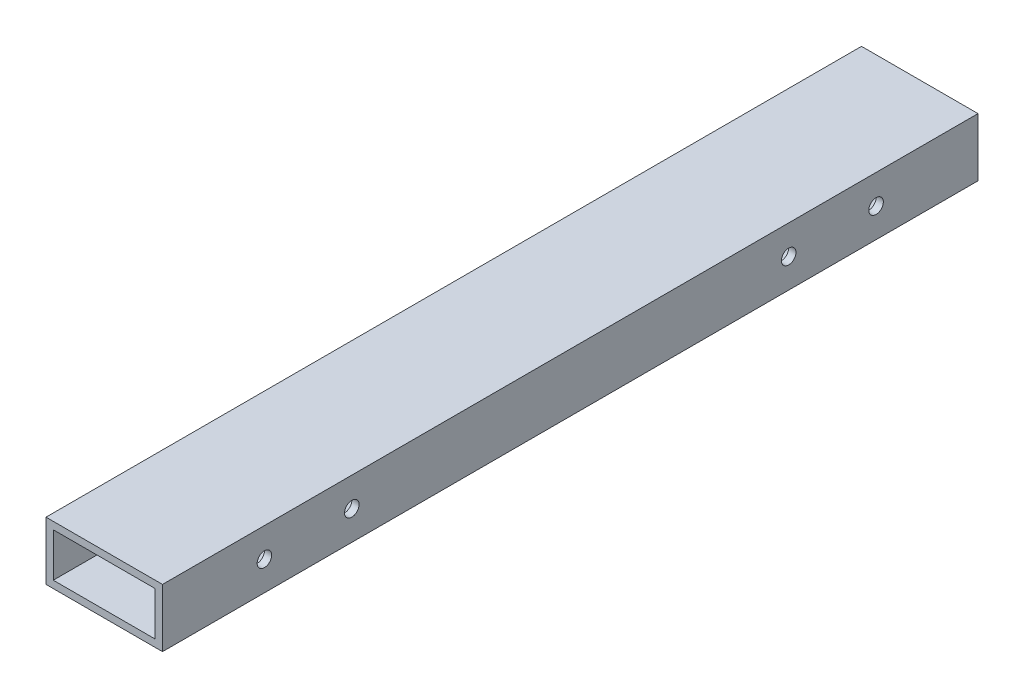
ISO-10303-21;
HEADER;
FILE_DESCRIPTION(('STEP AP214'),'2;1');
FILE_NAME('part.step','',(''),(''),'','','');
FILE_SCHEMA(('AUTOMOTIVE_DESIGN { 1 0 10303 214 1 1 1 1 }'));
ENDSEC;
DATA;
#1=APPLICATION_CONTEXT('core data for automotive mechanical design processes');
#2=APPLICATION_PROTOCOL_DEFINITION('international standard','automotive_design',2000,#1);
#3=PRODUCT_CONTEXT('',#1,'mechanical');
#4=PRODUCT('Part','Part','',(#3));
#5=PRODUCT_RELATED_PRODUCT_CATEGORY('part','',(#4));
#6=PRODUCT_DEFINITION_FORMATION('','',#4);
#7=PRODUCT_DEFINITION_CONTEXT('part definition',#1,'design');
#8=PRODUCT_DEFINITION('design','',#6,#7);
#9=PRODUCT_DEFINITION_SHAPE('','',#8);
#10=(LENGTH_UNIT() NAMED_UNIT(*) SI_UNIT(.MILLI.,.METRE.));
#11=(NAMED_UNIT(*) PLANE_ANGLE_UNIT() SI_UNIT($,.RADIAN.));
#12=(NAMED_UNIT(*) SI_UNIT($,.STERADIAN.) SOLID_ANGLE_UNIT());
#13=UNCERTAINTY_MEASURE_WITH_UNIT(LENGTH_MEASURE(1.E-05),#10,'distance_accuracy_value','');
#14=(GEOMETRIC_REPRESENTATION_CONTEXT(3) GLOBAL_UNCERTAINTY_ASSIGNED_CONTEXT((#13)) GLOBAL_UNIT_ASSIGNED_CONTEXT((#10,
#11,#12)) REPRESENTATION_CONTEXT('',''));
#15=CARTESIAN_POINT('',(0.,0.,0.));
#16=DIRECTION('',(0.,0.,1.));
#17=DIRECTION('',(1.,0.,0.));
#18=AXIS2_PLACEMENT_3D('',#15,#16,#17);
#19=CARTESIAN_POINT('',(0.,0.,355.6));
#20=DIRECTION('',(0.,0.,-1.));
#21=DIRECTION('',(-1.,0.,0.));
#22=AXIS2_PLACEMENT_3D('',#19,#20,#21);
#23=PLANE('',#22);
#24=DIRECTION('',(0.,-1.,0.));
#25=VECTOR('',#24,1.);
#26=CARTESIAN_POINT('',(0.,0.,355.6));
#27=LINE('',#26,#25);
#28=CARTESIAN_POINT('',(0.,25.4,355.6));
#29=VERTEX_POINT('',#28);
#30=CARTESIAN_POINT('',(0.,0.,355.6));
#31=VERTEX_POINT('',#30);
#32=EDGE_CURVE('E163',#29,#31,#27,.T.);
#33=ORIENTED_EDGE('',*,*,#32,.T.);
#34=DIRECTION('',(1.,0.,0.));
#35=VECTOR('',#34,1.);
#36=CARTESIAN_POINT('',(0.,0.,355.6));
#37=LINE('',#36,#35);
#38=CARTESIAN_POINT('',(50.8,0.,355.6));
#39=VERTEX_POINT('',#38);
#40=EDGE_CURVE('E167',#31,#39,#37,.T.);
#41=ORIENTED_EDGE('',*,*,#40,.T.);
#42=DIRECTION('',(0.,1.,0.));
#43=VECTOR('',#42,1.);
#44=CARTESIAN_POINT('',(50.8,0.,355.6));
#45=LINE('',#44,#43);
#46=CARTESIAN_POINT('',(50.8,25.4,355.6));
#47=VERTEX_POINT('',#46);
#48=EDGE_CURVE('E171',#39,#47,#45,.T.);
#49=ORIENTED_EDGE('',*,*,#48,.T.);
#50=DIRECTION('',(-1.,0.,0.));
#51=VECTOR('',#50,1.);
#52=CARTESIAN_POINT('',(0.,25.4,355.6));
#53=LINE('',#52,#51);
#54=EDGE_CURVE('E174',#47,#29,#53,.T.);
#55=ORIENTED_EDGE('',*,*,#54,.T.);
#56=EDGE_LOOP('',(#33,#41,#49,#55));
#57=FACE_BOUND('',#56,.T.);
#58=DIRECTION('',(0.,-1.,0.));
#59=VECTOR('',#58,1.);
#60=CARTESIAN_POINT('',(3.175,3.175,355.6));
#61=LINE('',#60,#59);
#62=CARTESIAN_POINT('',(3.175,22.225,355.6));
#63=VERTEX_POINT('',#62);
#64=CARTESIAN_POINT('',(3.175,3.175,355.6));
#65=VERTEX_POINT('',#64);
#66=EDGE_CURVE('E113',#63,#65,#61,.T.);
#67=ORIENTED_EDGE('',*,*,#66,.F.);
#68=DIRECTION('',(-1.,0.,0.));
#69=VECTOR('',#68,1.);
#70=CARTESIAN_POINT('',(3.175,22.225,355.6));
#71=LINE('',#70,#69);
#72=CARTESIAN_POINT('',(47.625,22.225,355.6));
#73=VERTEX_POINT('',#72);
#74=EDGE_CURVE('E139',#73,#63,#71,.T.);
#75=ORIENTED_EDGE('',*,*,#74,.F.);
#76=DIRECTION('',(0.,1.,0.));
#77=VECTOR('',#76,1.);
#78=CARTESIAN_POINT('',(47.625,3.175,355.6));
#79=LINE('',#78,#77);
#80=CARTESIAN_POINT('',(47.625,3.175,355.6));
#81=VERTEX_POINT('',#80);
#82=EDGE_CURVE('E135',#81,#73,#79,.T.);
#83=ORIENTED_EDGE('',*,*,#82,.F.);
#84=DIRECTION('',(1.,0.,0.));
#85=VECTOR('',#84,1.);
#86=CARTESIAN_POINT('',(3.175,3.175,355.6));
#87=LINE('',#86,#85);
#88=EDGE_CURVE('E122',#65,#81,#87,.T.);
#89=ORIENTED_EDGE('',*,*,#88,.F.);
#90=EDGE_LOOP('',(#67,#75,#83,#89));
#91=FACE_BOUND('',#90,.T.);
#92=ADVANCED_FACE('F45',(#57,#91),#23,.F.);
#93=CARTESIAN_POINT('',(0.,0.,0.));
#94=DIRECTION('',(0.,0.,-1.));
#95=DIRECTION('',(-1.,0.,0.));
#96=AXIS2_PLACEMENT_3D('',#93,#94,#95);
#97=PLANE('',#96);
#98=DIRECTION('',(0.,-1.,0.));
#99=VECTOR('',#98,1.);
#100=CARTESIAN_POINT('',(0.,0.,0.));
#101=LINE('',#100,#99);
#102=CARTESIAN_POINT('',(0.,25.4,0.));
#103=VERTEX_POINT('',#102);
#104=CARTESIAN_POINT('',(0.,0.,0.));
#105=VERTEX_POINT('',#104);
#106=EDGE_CURVE('E131',#103,#105,#101,.T.);
#107=ORIENTED_EDGE('',*,*,#106,.F.);
#108=DIRECTION('',(-1.,0.,0.));
#109=VECTOR('',#108,1.);
#110=CARTESIAN_POINT('',(0.,25.4,0.));
#111=LINE('',#110,#109);
#112=CARTESIAN_POINT('',(50.8,25.4,0.));
#113=VERTEX_POINT('',#112);
#114=EDGE_CURVE('E168',#113,#103,#111,.T.);
#115=ORIENTED_EDGE('',*,*,#114,.F.);
#116=DIRECTION('',(0.,1.,0.));
#117=VECTOR('',#116,1.);
#118=CARTESIAN_POINT('',(50.8,0.,0.));
#119=LINE('',#118,#117);
#120=CARTESIAN_POINT('',(50.8,0.,0.));
#121=VERTEX_POINT('',#120);
#122=EDGE_CURVE('E184',#121,#113,#119,.T.);
#123=ORIENTED_EDGE('',*,*,#122,.F.);
#124=DIRECTION('',(1.,0.,0.));
#125=VECTOR('',#124,1.);
#126=CARTESIAN_POINT('',(0.,0.,0.));
#127=LINE('',#126,#125);
#128=EDGE_CURVE('E181',#105,#121,#127,.T.);
#129=ORIENTED_EDGE('',*,*,#128,.F.);
#130=EDGE_LOOP('',(#107,#115,#123,#129));
#131=FACE_BOUND('',#130,.T.);
#132=DIRECTION('',(-1.,0.,0.));
#133=VECTOR('',#132,1.);
#134=CARTESIAN_POINT('',(3.175,22.225,0.));
#135=LINE('',#134,#133);
#136=CARTESIAN_POINT('',(47.625,22.225,0.));
#137=VERTEX_POINT('',#136);
#138=CARTESIAN_POINT('',(3.175,22.225,0.));
#139=VERTEX_POINT('',#138);
#140=EDGE_CURVE('E123',#137,#139,#135,.T.);
#141=ORIENTED_EDGE('',*,*,#140,.T.);
#142=DIRECTION('',(0.,-1.,0.));
#143=VECTOR('',#142,1.);
#144=CARTESIAN_POINT('',(3.175,3.175,0.));
#145=LINE('',#144,#143);
#146=CARTESIAN_POINT('',(3.175,3.175,0.));
#147=VERTEX_POINT('',#146);
#148=EDGE_CURVE('E71',#139,#147,#145,.T.);
#149=ORIENTED_EDGE('',*,*,#148,.T.);
#150=DIRECTION('',(1.,0.,0.));
#151=VECTOR('',#150,1.);
#152=CARTESIAN_POINT('',(3.175,3.175,0.));
#153=LINE('',#152,#151);
#154=CARTESIAN_POINT('',(47.625,3.175,0.));
#155=VERTEX_POINT('',#154);
#156=EDGE_CURVE('E129',#147,#155,#153,.T.);
#157=ORIENTED_EDGE('',*,*,#156,.T.);
#158=DIRECTION('',(0.,1.,0.));
#159=VECTOR('',#158,1.);
#160=CARTESIAN_POINT('',(47.625,3.175,0.));
#161=LINE('',#160,#159);
#162=EDGE_CURVE('E150',#155,#137,#161,.T.);
#163=ORIENTED_EDGE('',*,*,#162,.T.);
#164=EDGE_LOOP('',(#141,#149,#157,#163));
#165=FACE_BOUND('',#164,.T.);
#166=ADVANCED_FACE('F248',(#131,#165),#97,.T.);
#167=CARTESIAN_POINT('',(0.,0.,355.6));
#168=DIRECTION('',(1.,0.,0.));
#169=DIRECTION('',(0.,0.,-1.));
#170=AXIS2_PLACEMENT_3D('',#167,#168,#169);
#171=PLANE('',#170);
#172=CARTESIAN_POINT('',(0.,12.7,311.15));
#173=DIRECTION('',(1.,0.,0.));
#174=DIRECTION('',(0.,0.,-1.));
#175=AXIS2_PLACEMENT_3D('',#172,#173,#174);
#176=CIRCLE('',#175,3.17499999999997);
#177=CARTESIAN_POINT('',(0.,12.7,307.975));
#178=VERTEX_POINT('',#177);
#179=EDGE_CURVE('E204',#178,#178,#176,.T.);
#180=ORIENTED_EDGE('',*,*,#179,.T.);
#181=EDGE_LOOP('',(#180));
#182=FACE_BOUND('',#181,.T.);
#183=CARTESIAN_POINT('',(0.,12.7,82.55));
#184=DIRECTION('',(1.,0.,0.));
#185=DIRECTION('',(0.,0.,1.));
#186=AXIS2_PLACEMENT_3D('',#183,#184,#185);
#187=CIRCLE('',#186,3.17499999999997);
#188=CARTESIAN_POINT('',(0.,12.7,85.7249999999999));
#189=VERTEX_POINT('',#188);
#190=EDGE_CURVE('E306',#189,#189,#187,.T.);
#191=ORIENTED_EDGE('',*,*,#190,.T.);
#192=EDGE_LOOP('',(#191));
#193=FACE_BOUND('',#192,.T.);
#194=CARTESIAN_POINT('',(0.,12.7,44.4499999999999));
#195=DIRECTION('',(1.,0.,0.));
#196=DIRECTION('',(0.,0.,1.));
#197=AXIS2_PLACEMENT_3D('',#194,#195,#196);
#198=CIRCLE('',#197,3.17499999999997);
#199=CARTESIAN_POINT('',(0.,12.7,47.6249999999999));
#200=VERTEX_POINT('',#199);
#201=EDGE_CURVE('E310',#200,#200,#198,.T.);
#202=ORIENTED_EDGE('',*,*,#201,.T.);
#203=EDGE_LOOP('',(#202));
#204=FACE_BOUND('',#203,.T.);
#205=CARTESIAN_POINT('',(0.,12.7,273.05));
#206=DIRECTION('',(1.,0.,0.));
#207=DIRECTION('',(0.,0.,-1.));
#208=AXIS2_PLACEMENT_3D('',#205,#206,#207);
#209=CIRCLE('',#208,3.17499999999997);
#210=CARTESIAN_POINT('',(0.,12.7,269.875));
#211=VERTEX_POINT('',#210);
#212=EDGE_CURVE('E313',#211,#211,#209,.T.);
#213=ORIENTED_EDGE('',*,*,#212,.T.);
#214=EDGE_LOOP('',(#213));
#215=FACE_BOUND('',#214,.T.);
#216=ORIENTED_EDGE('',*,*,#106,.T.);
#217=DIRECTION('',(0.,0.,-1.));
#218=VECTOR('',#217,1.);
#219=CARTESIAN_POINT('',(0.,0.,355.6));
#220=LINE('',#219,#218);
#221=EDGE_CURVE('E11',#31,#105,#220,.T.);
#222=ORIENTED_EDGE('',*,*,#221,.F.);
#223=ORIENTED_EDGE('',*,*,#32,.F.);
#224=DIRECTION('',(0.,0.,-1.));
#225=VECTOR('',#224,1.);
#226=CARTESIAN_POINT('',(0.,25.4,355.6));
#227=LINE('',#226,#225);
#228=EDGE_CURVE('E177',#29,#103,#227,.T.);
#229=ORIENTED_EDGE('',*,*,#228,.T.);
#230=EDGE_LOOP('',(#216,#222,#223,#229));
#231=FACE_BOUND('',#230,.T.);
#232=ADVANCED_FACE('F47',(#182,#193,#204,#215,#231),#171,.F.);
#233=CARTESIAN_POINT('',(0.,0.,355.6));
#234=DIRECTION('',(0.,1.,0.));
#235=DIRECTION('',(0.,0.,1.));
#236=AXIS2_PLACEMENT_3D('',#233,#234,#235);
#237=PLANE('',#236);
#238=ORIENTED_EDGE('',*,*,#128,.T.);
#239=DIRECTION('',(0.,0.,-1.));
#240=VECTOR('',#239,1.);
#241=CARTESIAN_POINT('',(50.8,0.,355.6));
#242=LINE('',#241,#240);
#243=EDGE_CURVE('E55',#39,#121,#242,.T.);
#244=ORIENTED_EDGE('',*,*,#243,.F.);
#245=ORIENTED_EDGE('',*,*,#40,.F.);
#246=ORIENTED_EDGE('',*,*,#221,.T.);
#247=EDGE_LOOP('',(#238,#244,#245,#246));
#248=FACE_BOUND('',#247,.T.);
#249=ADVANCED_FACE('F279',(#248),#237,.F.);
#250=CARTESIAN_POINT('',(50.8,0.,355.6));
#251=DIRECTION('',(-1.,0.,0.));
#252=DIRECTION('',(0.,0.,1.));
#253=AXIS2_PLACEMENT_3D('',#250,#251,#252);
#254=PLANE('',#253);
#255=CARTESIAN_POINT('',(50.8,12.7,311.15));
#256=DIRECTION('',(1.,0.,0.));
#257=DIRECTION('',(0.,0.,-1.));
#258=AXIS2_PLACEMENT_3D('',#255,#256,#257);
#259=CIRCLE('',#258,3.17499999999997);
#260=CARTESIAN_POINT('',(50.8,12.7,307.975));
#261=VERTEX_POINT('',#260);
#262=EDGE_CURVE('E322',#261,#261,#259,.T.);
#263=ORIENTED_EDGE('',*,*,#262,.F.);
#264=EDGE_LOOP('',(#263));
#265=FACE_BOUND('',#264,.T.);
#266=CARTESIAN_POINT('',(50.8,12.7,82.55));
#267=DIRECTION('',(1.,0.,0.));
#268=DIRECTION('',(0.,0.,1.));
#269=AXIS2_PLACEMENT_3D('',#266,#267,#268);
#270=CIRCLE('',#269,3.17499999999997);
#271=CARTESIAN_POINT('',(50.8,12.7,85.7249999999999));
#272=VERTEX_POINT('',#271);
#273=EDGE_CURVE('E328',#272,#272,#270,.T.);
#274=ORIENTED_EDGE('',*,*,#273,.F.);
#275=EDGE_LOOP('',(#274));
#276=FACE_BOUND('',#275,.T.);
#277=CARTESIAN_POINT('',(50.8,12.7,44.4499999999999));
#278=DIRECTION('',(1.,0.,0.));
#279=DIRECTION('',(0.,0.,1.));
#280=AXIS2_PLACEMENT_3D('',#277,#278,#279);
#281=CIRCLE('',#280,3.17499999999997);
#282=CARTESIAN_POINT('',(50.8,12.7,47.6249999999999));
#283=VERTEX_POINT('',#282);
#284=EDGE_CURVE('E317',#283,#283,#281,.T.);
#285=ORIENTED_EDGE('',*,*,#284,.F.);
#286=EDGE_LOOP('',(#285));
#287=FACE_BOUND('',#286,.T.);
#288=CARTESIAN_POINT('',(50.8,12.7,273.05));
#289=DIRECTION('',(1.,0.,0.));
#290=DIRECTION('',(0.,0.,-1.));
#291=AXIS2_PLACEMENT_3D('',#288,#289,#290);
#292=CIRCLE('',#291,3.17499999999997);
#293=CARTESIAN_POINT('',(50.8,12.7,269.875));
#294=VERTEX_POINT('',#293);
#295=EDGE_CURVE('E316',#294,#294,#292,.T.);
#296=ORIENTED_EDGE('',*,*,#295,.F.);
#297=EDGE_LOOP('',(#296));
#298=FACE_BOUND('',#297,.T.);
#299=ORIENTED_EDGE('',*,*,#122,.T.);
#300=DIRECTION('',(0.,0.,-1.));
#301=VECTOR('',#300,1.);
#302=CARTESIAN_POINT('',(50.8,25.4,355.6));
#303=LINE('',#302,#301);
#304=EDGE_CURVE('E192',#47,#113,#303,.T.);
#305=ORIENTED_EDGE('',*,*,#304,.F.);
#306=ORIENTED_EDGE('',*,*,#48,.F.);
#307=ORIENTED_EDGE('',*,*,#243,.T.);
#308=EDGE_LOOP('',(#299,#305,#306,#307));
#309=FACE_BOUND('',#308,.T.);
#310=ADVANCED_FACE('F276',(#265,#276,#287,#298,#309),#254,.F.);
#311=CARTESIAN_POINT('',(0.,25.4,355.6));
#312=DIRECTION('',(0.,-1.,0.));
#313=DIRECTION('',(0.,0.,-1.));
#314=AXIS2_PLACEMENT_3D('',#311,#312,#313);
#315=PLANE('',#314);
#316=ORIENTED_EDGE('',*,*,#114,.T.);
#317=ORIENTED_EDGE('',*,*,#228,.F.);
#318=ORIENTED_EDGE('',*,*,#54,.F.);
#319=ORIENTED_EDGE('',*,*,#304,.T.);
#320=EDGE_LOOP('',(#316,#317,#318,#319));
#321=FACE_BOUND('',#320,.T.);
#322=ADVANCED_FACE('F273',(#321),#315,.F.);
#323=CARTESIAN_POINT('',(3.175,3.175,355.6));
#324=DIRECTION('',(1.,0.,0.));
#325=DIRECTION('',(0.,0.,-1.));
#326=AXIS2_PLACEMENT_3D('',#323,#324,#325);
#327=PLANE('',#326);
#328=CARTESIAN_POINT('',(3.175,12.7,311.15));
#329=DIRECTION('',(1.,0.,0.));
#330=DIRECTION('',(0.,0.,-1.));
#331=AXIS2_PLACEMENT_3D('',#328,#329,#330);
#332=CIRCLE('',#331,3.17499999999997);
#333=CARTESIAN_POINT('',(3.175,12.7,307.975));
#334=VERTEX_POINT('',#333);
#335=EDGE_CURVE('E147',#334,#334,#332,.T.);
#336=ORIENTED_EDGE('',*,*,#335,.F.);
#337=EDGE_LOOP('',(#336));
#338=FACE_BOUND('',#337,.T.);
#339=CARTESIAN_POINT('',(3.175,12.7,82.55));
#340=DIRECTION('',(1.,0.,0.));
#341=DIRECTION('',(0.,0.,-1.));
#342=AXIS2_PLACEMENT_3D('',#339,#340,#341);
#343=CIRCLE('',#342,3.17499999999997);
#344=CARTESIAN_POINT('',(3.175,12.7,79.375));
#345=VERTEX_POINT('',#344);
#346=EDGE_CURVE('E212',#345,#345,#343,.T.);
#347=ORIENTED_EDGE('',*,*,#346,.F.);
#348=EDGE_LOOP('',(#347));
#349=FACE_BOUND('',#348,.T.);
#350=CARTESIAN_POINT('',(3.175,12.7,44.4499999999999));
#351=DIRECTION('',(1.,0.,0.));
#352=DIRECTION('',(0.,0.,-1.));
#353=AXIS2_PLACEMENT_3D('',#350,#351,#352);
#354=CIRCLE('',#353,3.17499999999997);
#355=CARTESIAN_POINT('',(3.175,12.7,41.275));
#356=VERTEX_POINT('',#355);
#357=EDGE_CURVE('E208',#356,#356,#354,.T.);
#358=ORIENTED_EDGE('',*,*,#357,.F.);
#359=EDGE_LOOP('',(#358));
#360=FACE_BOUND('',#359,.T.);
#361=CARTESIAN_POINT('',(3.175,12.7,273.05));
#362=DIRECTION('',(1.,0.,0.));
#363=DIRECTION('',(0.,0.,-1.));
#364=AXIS2_PLACEMENT_3D('',#361,#362,#363);
#365=CIRCLE('',#364,3.17499999999997);
#366=CARTESIAN_POINT('',(3.175,12.7,269.875));
#367=VERTEX_POINT('',#366);
#368=EDGE_CURVE('E203',#367,#367,#365,.T.);
#369=ORIENTED_EDGE('',*,*,#368,.F.);
#370=EDGE_LOOP('',(#369));
#371=FACE_BOUND('',#370,.T.);
#372=ORIENTED_EDGE('',*,*,#148,.F.);
#373=DIRECTION('',(0.,0.,-1.));
#374=VECTOR('',#373,1.);
#375=CARTESIAN_POINT('',(3.175,22.225,355.6));
#376=LINE('',#375,#374);
#377=EDGE_CURVE('E117',#63,#139,#376,.T.);
#378=ORIENTED_EDGE('',*,*,#377,.F.);
#379=ORIENTED_EDGE('',*,*,#66,.T.);
#380=DIRECTION('',(0.,0.,-1.));
#381=VECTOR('',#380,1.);
#382=CARTESIAN_POINT('',(3.175,3.175,355.6));
#383=LINE('',#382,#381);
#384=EDGE_CURVE('E116',#65,#147,#383,.T.);
#385=ORIENTED_EDGE('',*,*,#384,.T.);
#386=EDGE_LOOP('',(#372,#378,#379,#385));
#387=FACE_BOUND('',#386,.T.);
#388=ADVANCED_FACE('F115',(#338,#349,#360,#371,#387),#327,.T.);
#389=CARTESIAN_POINT('',(3.175,3.175,355.6));
#390=DIRECTION('',(0.,1.,0.));
#391=DIRECTION('',(0.,0.,1.));
#392=AXIS2_PLACEMENT_3D('',#389,#390,#391);
#393=PLANE('',#392);
#394=ORIENTED_EDGE('',*,*,#156,.F.);
#395=ORIENTED_EDGE('',*,*,#384,.F.);
#396=ORIENTED_EDGE('',*,*,#88,.T.);
#397=DIRECTION('',(0.,0.,-1.));
#398=VECTOR('',#397,1.);
#399=CARTESIAN_POINT('',(47.625,3.175,355.6));
#400=LINE('',#399,#398);
#401=EDGE_CURVE('E132',#81,#155,#400,.T.);
#402=ORIENTED_EDGE('',*,*,#401,.T.);
#403=EDGE_LOOP('',(#394,#395,#396,#402));
#404=FACE_BOUND('',#403,.T.);
#405=ADVANCED_FACE('F126',(#404),#393,.T.);
#406=CARTESIAN_POINT('',(47.625,3.175,355.6));
#407=DIRECTION('',(-1.,0.,0.));
#408=DIRECTION('',(0.,0.,1.));
#409=AXIS2_PLACEMENT_3D('',#406,#407,#408);
#410=PLANE('',#409);
#411=CARTESIAN_POINT('',(47.625,12.7,311.15));
#412=DIRECTION('',(-1.,0.,0.));
#413=DIRECTION('',(0.,0.,1.));
#414=AXIS2_PLACEMENT_3D('',#411,#412,#413);
#415=CIRCLE('',#414,3.17499999999997);
#416=CARTESIAN_POINT('',(47.625,12.7,314.325));
#417=VERTEX_POINT('',#416);
#418=EDGE_CURVE('E49',#417,#417,#415,.T.);
#419=ORIENTED_EDGE('',*,*,#418,.F.);
#420=EDGE_LOOP('',(#419));
#421=FACE_BOUND('',#420,.T.);
#422=CARTESIAN_POINT('',(47.625,12.7,82.55));
#423=DIRECTION('',(-1.,0.,0.));
#424=DIRECTION('',(0.,0.,1.));
#425=AXIS2_PLACEMENT_3D('',#422,#423,#424);
#426=CIRCLE('',#425,3.17499999999997);
#427=CARTESIAN_POINT('',(47.625,12.7,85.7249999999999));
#428=VERTEX_POINT('',#427);
#429=EDGE_CURVE('E209',#428,#428,#426,.T.);
#430=ORIENTED_EDGE('',*,*,#429,.F.);
#431=EDGE_LOOP('',(#430));
#432=FACE_BOUND('',#431,.T.);
#433=CARTESIAN_POINT('',(47.625,12.7,44.4499999999999));
#434=DIRECTION('',(-1.,0.,0.));
#435=DIRECTION('',(0.,0.,1.));
#436=AXIS2_PLACEMENT_3D('',#433,#434,#435);
#437=CIRCLE('',#436,3.17499999999997);
#438=CARTESIAN_POINT('',(47.625,12.7,47.6249999999999));
#439=VERTEX_POINT('',#438);
#440=EDGE_CURVE('E205',#439,#439,#437,.T.);
#441=ORIENTED_EDGE('',*,*,#440,.F.);
#442=EDGE_LOOP('',(#441));
#443=FACE_BOUND('',#442,.T.);
#444=CARTESIAN_POINT('',(47.625,12.7,273.05));
#445=DIRECTION('',(-1.,0.,0.));
#446=DIRECTION('',(0.,0.,1.));
#447=AXIS2_PLACEMENT_3D('',#444,#445,#446);
#448=CIRCLE('',#447,3.17499999999997);
#449=CARTESIAN_POINT('',(47.625,12.7,276.225));
#450=VERTEX_POINT('',#449);
#451=EDGE_CURVE('E199',#450,#450,#448,.T.);
#452=ORIENTED_EDGE('',*,*,#451,.F.);
#453=EDGE_LOOP('',(#452));
#454=FACE_BOUND('',#453,.T.);
#455=ORIENTED_EDGE('',*,*,#162,.F.);
#456=ORIENTED_EDGE('',*,*,#401,.F.);
#457=ORIENTED_EDGE('',*,*,#82,.T.);
#458=DIRECTION('',(0.,0.,-1.));
#459=VECTOR('',#458,1.);
#460=CARTESIAN_POINT('',(47.625,22.225,355.6));
#461=LINE('',#460,#459);
#462=EDGE_CURVE('E63',#73,#137,#461,.T.);
#463=ORIENTED_EDGE('',*,*,#462,.T.);
#464=EDGE_LOOP('',(#455,#456,#457,#463));
#465=FACE_BOUND('',#464,.T.);
#466=ADVANCED_FACE('F236',(#421,#432,#443,#454,#465),#410,.T.);
#467=CARTESIAN_POINT('',(3.175,22.225,355.6));
#468=DIRECTION('',(0.,-1.,0.));
#469=DIRECTION('',(0.,0.,-1.));
#470=AXIS2_PLACEMENT_3D('',#467,#468,#469);
#471=PLANE('',#470);
#472=ORIENTED_EDGE('',*,*,#140,.F.);
#473=ORIENTED_EDGE('',*,*,#462,.F.);
#474=ORIENTED_EDGE('',*,*,#74,.T.);
#475=ORIENTED_EDGE('',*,*,#377,.T.);
#476=EDGE_LOOP('',(#472,#473,#474,#475));
#477=FACE_BOUND('',#476,.T.);
#478=ADVANCED_FACE('F239',(#477),#471,.T.);
#479=CARTESIAN_POINT('',(0.,12.7,273.05));
#480=DIRECTION('',(1.,0.,0.));
#481=DIRECTION('',(0.,0.,-1.));
#482=AXIS2_PLACEMENT_3D('',#479,#480,#481);
#483=CYLINDRICAL_SURFACE('',#482,3.17499999999997);
#484=ORIENTED_EDGE('',*,*,#451,.T.);
#485=EDGE_LOOP('',(#484));
#486=FACE_BOUND('',#485,.T.);
#487=ORIENTED_EDGE('',*,*,#295,.T.);
#488=EDGE_LOOP('',(#487));
#489=FACE_BOUND('',#488,.T.);
#490=ADVANCED_FACE('F250',(#486,#489),#483,.F.);
#491=CARTESIAN_POINT('',(0.,12.7,44.4499999999999));
#492=DIRECTION('',(1.,0.,0.));
#493=DIRECTION('',(0.,0.,-1.));
#494=AXIS2_PLACEMENT_3D('',#491,#492,#493);
#495=CYLINDRICAL_SURFACE('',#494,3.17499999999997);
#496=ORIENTED_EDGE('',*,*,#440,.T.);
#497=EDGE_LOOP('',(#496));
#498=FACE_BOUND('',#497,.T.);
#499=ORIENTED_EDGE('',*,*,#284,.T.);
#500=EDGE_LOOP('',(#499));
#501=FACE_BOUND('',#500,.T.);
#502=ADVANCED_FACE('F257',(#498,#501),#495,.F.);
#503=CARTESIAN_POINT('',(0.,12.7,82.55));
#504=DIRECTION('',(1.,0.,0.));
#505=DIRECTION('',(0.,0.,-1.));
#506=AXIS2_PLACEMENT_3D('',#503,#504,#505);
#507=CYLINDRICAL_SURFACE('',#506,3.17499999999997);
#508=ORIENTED_EDGE('',*,*,#429,.T.);
#509=EDGE_LOOP('',(#508));
#510=FACE_BOUND('',#509,.T.);
#511=ORIENTED_EDGE('',*,*,#273,.T.);
#512=EDGE_LOOP('',(#511));
#513=FACE_BOUND('',#512,.T.);
#514=ADVANCED_FACE('F359',(#510,#513),#507,.F.);
#515=CARTESIAN_POINT('',(0.,12.7,311.15));
#516=DIRECTION('',(1.,0.,0.));
#517=DIRECTION('',(0.,0.,-1.));
#518=AXIS2_PLACEMENT_3D('',#515,#516,#517);
#519=CYLINDRICAL_SURFACE('',#518,3.17499999999997);
#520=ORIENTED_EDGE('',*,*,#418,.T.);
#521=EDGE_LOOP('',(#520));
#522=FACE_BOUND('',#521,.T.);
#523=ORIENTED_EDGE('',*,*,#262,.T.);
#524=EDGE_LOOP('',(#523));
#525=FACE_BOUND('',#524,.T.);
#526=ADVANCED_FACE('F233',(#522,#525),#519,.F.);
#527=ORIENTED_EDGE('',*,*,#368,.T.);
#528=EDGE_LOOP('',(#527));
#529=FACE_BOUND('',#528,.T.);
#530=ORIENTED_EDGE('',*,*,#212,.F.);
#531=EDGE_LOOP('',(#530));
#532=FACE_BOUND('',#531,.T.);
#533=ADVANCED_FACE('F260',(#529,#532),#483,.F.);
#534=ORIENTED_EDGE('',*,*,#357,.T.);
#535=EDGE_LOOP('',(#534));
#536=FACE_BOUND('',#535,.T.);
#537=ORIENTED_EDGE('',*,*,#201,.F.);
#538=EDGE_LOOP('',(#537));
#539=FACE_BOUND('',#538,.T.);
#540=ADVANCED_FACE('F357',(#536,#539),#495,.F.);
#541=ORIENTED_EDGE('',*,*,#346,.T.);
#542=EDGE_LOOP('',(#541));
#543=FACE_BOUND('',#542,.T.);
#544=ORIENTED_EDGE('',*,*,#190,.F.);
#545=EDGE_LOOP('',(#544));
#546=FACE_BOUND('',#545,.T.);
#547=ADVANCED_FACE('F353',(#543,#546),#507,.F.);
#548=ORIENTED_EDGE('',*,*,#335,.T.);
#549=EDGE_LOOP('',(#548));
#550=FACE_BOUND('',#549,.T.);
#551=ORIENTED_EDGE('',*,*,#179,.F.);
#552=EDGE_LOOP('',(#551));
#553=FACE_BOUND('',#552,.T.);
#554=ADVANCED_FACE('F356',(#550,#553),#519,.F.);
#555=CLOSED_SHELL('',(#92,#166,#232,#249,#310,#322,#388,#405,#466,#478,#490,#502,#514,#526,#533,
#540,#547,#554));
#556=MANIFOLD_SOLID_BREP('B2',#555);
#557=ADVANCED_BREP_SHAPE_REPRESENTATION('',(#18,#556),#14);
#558=SHAPE_DEFINITION_REPRESENTATION(#9,#557);
ENDSEC;
END-ISO-10303-21;
